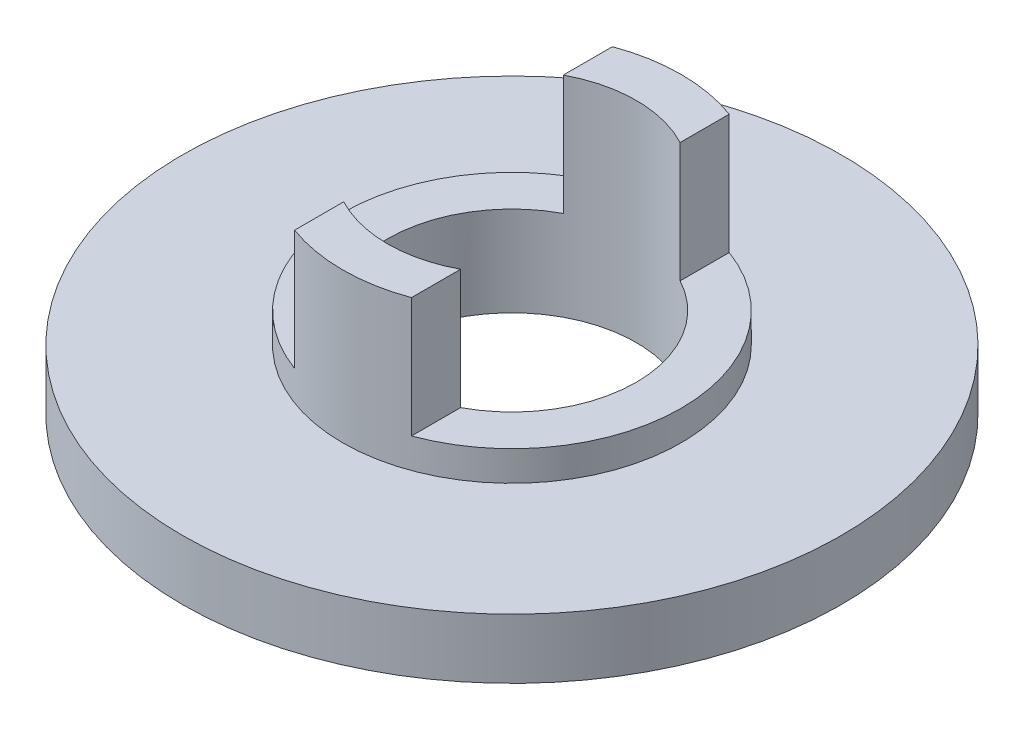
ISO-10303-21;
HEADER;
FILE_DESCRIPTION(('STEP AP214'),'2;1');
FILE_NAME('part.step','',(''),(''),'','','');
FILE_SCHEMA(('AUTOMOTIVE_DESIGN { 1 0 10303 214 1 1 1 1 }'));
ENDSEC;
DATA;
#1=APPLICATION_CONTEXT('core data for automotive mechanical design processes');
#2=APPLICATION_PROTOCOL_DEFINITION('international standard','automotive_design',2000,#1);
#3=PRODUCT_CONTEXT('',#1,'mechanical');
#4=PRODUCT('Part','Part','',(#3));
#5=PRODUCT_RELATED_PRODUCT_CATEGORY('part','',(#4));
#6=PRODUCT_DEFINITION_FORMATION('','',#4);
#7=PRODUCT_DEFINITION_CONTEXT('part definition',#1,'design');
#8=PRODUCT_DEFINITION('design','',#6,#7);
#9=PRODUCT_DEFINITION_SHAPE('','',#8);
#10=(LENGTH_UNIT() NAMED_UNIT(*) SI_UNIT(.MILLI.,.METRE.));
#11=(NAMED_UNIT(*) PLANE_ANGLE_UNIT() SI_UNIT($,.RADIAN.));
#12=(NAMED_UNIT(*) SI_UNIT($,.STERADIAN.) SOLID_ANGLE_UNIT());
#13=UNCERTAINTY_MEASURE_WITH_UNIT(LENGTH_MEASURE(1.E-05),#10,'distance_accuracy_value','');
#14=(GEOMETRIC_REPRESENTATION_CONTEXT(3) GLOBAL_UNCERTAINTY_ASSIGNED_CONTEXT((#13)) GLOBAL_UNIT_ASSIGNED_CONTEXT((#10,
#11,#12)) REPRESENTATION_CONTEXT('',''));
#15=CARTESIAN_POINT('',(0.,0.,0.));
#16=DIRECTION('',(0.,0.,1.));
#17=DIRECTION('',(1.,0.,0.));
#18=AXIS2_PLACEMENT_3D('',#15,#16,#17);
#19=CARTESIAN_POINT('',(0.,5.,0.));
#20=DIRECTION('',(0.,1.,0.));
#21=DIRECTION('',(0.,0.,1.));
#22=AXIS2_PLACEMENT_3D('',#19,#20,#21);
#23=PLANE('',#22);
#24=DIRECTION('',(0.,0.,1.));
#25=VECTOR('',#24,1.);
#26=CARTESIAN_POINT('',(1.95,5.,3.66333181680284));
#27=LINE('',#26,#25);
#28=CARTESIAN_POINT('',(1.95,5.,3.66333181680284));
#29=VERTEX_POINT('',#28);
#30=CARTESIAN_POINT('',(1.95,5.,5.30282943342514));
#31=VERTEX_POINT('',#30);
#32=EDGE_CURVE('E132',#29,#31,#27,.T.);
#33=ORIENTED_EDGE('',*,*,#32,.F.);
#34=CARTESIAN_POINT('',(0.,5.,0.));
#35=DIRECTION('',(0.,1.,0.));
#36=DIRECTION('',(0.,0.,1.));
#37=AXIS2_PLACEMENT_3D('',#34,#35,#36);
#38=CIRCLE('',#37,4.15);
#39=CARTESIAN_POINT('',(-1.95,5.,3.66333181680284));
#40=VERTEX_POINT('',#39);
#41=EDGE_CURVE('E183',#40,#29,#38,.T.);
#42=ORIENTED_EDGE('',*,*,#41,.F.);
#43=DIRECTION('',(0.,0.,-1.));
#44=VECTOR('',#43,1.);
#45=CARTESIAN_POINT('',(-1.95,5.,3.66333181680284));
#46=LINE('',#45,#44);
#47=CARTESIAN_POINT('',(-1.95,5.,5.30282943342514));
#48=VERTEX_POINT('',#47);
#49=EDGE_CURVE('E165',#48,#40,#46,.T.);
#50=ORIENTED_EDGE('',*,*,#49,.F.);
#51=CARTESIAN_POINT('',(0.,5.,0.));
#52=DIRECTION('',(0.,1.,0.));
#53=DIRECTION('',(0.,0.,1.));
#54=AXIS2_PLACEMENT_3D('',#51,#52,#53);
#55=CIRCLE('',#54,5.65);
#56=EDGE_CURVE('E189',#48,#31,#55,.T.);
#57=ORIENTED_EDGE('',*,*,#56,.T.);
#58=EDGE_LOOP('',(#33,#42,#50,#57));
#59=FACE_BOUND('',#58,.T.);
#60=ADVANCED_FACE('F49',(#59),#23,.T.);
#61=CARTESIAN_POINT('',(0.,-2.,0.));
#62=DIRECTION('',(0.,1.,0.));
#63=DIRECTION('',(0.,0.,1.));
#64=AXIS2_PLACEMENT_3D('',#61,#62,#63);
#65=CYLINDRICAL_SURFACE('',#64,11.);
#66=CARTESIAN_POINT('',(0.,-2.,0.));
#67=DIRECTION('',(0.,1.,0.));
#68=DIRECTION('',(0.,0.,1.));
#69=AXIS2_PLACEMENT_3D('',#66,#67,#68);
#70=CIRCLE('',#69,11.);
#71=CARTESIAN_POINT('',(0.,-2.,11.));
#72=VERTEX_POINT('',#71);
#73=EDGE_CURVE('E12',#72,#72,#70,.T.);
#74=ORIENTED_EDGE('',*,*,#73,.T.);
#75=EDGE_LOOP('',(#74));
#76=FACE_BOUND('',#75,.T.);
#77=CARTESIAN_POINT('',(0.,0.,0.));
#78=DIRECTION('',(0.,1.,0.));
#79=DIRECTION('',(0.,0.,1.));
#80=AXIS2_PLACEMENT_3D('',#77,#78,#79);
#81=CIRCLE('',#80,11.);
#82=CARTESIAN_POINT('',(0.,0.,11.));
#83=VERTEX_POINT('',#82);
#84=EDGE_CURVE('E53',#83,#83,#81,.T.);
#85=ORIENTED_EDGE('',*,*,#84,.F.);
#86=EDGE_LOOP('',(#85));
#87=FACE_BOUND('',#86,.T.);
#88=ADVANCED_FACE('F51',(#76,#87),#65,.T.);
#89=CARTESIAN_POINT('',(0.,-2.,0.));
#90=DIRECTION('',(0.,1.,0.));
#91=DIRECTION('',(0.,0.,1.));
#92=AXIS2_PLACEMENT_3D('',#89,#90,#91);
#93=PLANE('',#92);
#94=CARTESIAN_POINT('',(0.,-2.,0.));
#95=DIRECTION('',(0.,1.,0.));
#96=DIRECTION('',(0.,0.,1.));
#97=AXIS2_PLACEMENT_3D('',#94,#95,#96);
#98=CIRCLE('',#97,4.15);
#99=CARTESIAN_POINT('',(0.,-2.,4.15));
#100=VERTEX_POINT('',#99);
#101=EDGE_CURVE('E197',#100,#100,#98,.T.);
#102=ORIENTED_EDGE('',*,*,#101,.T.);
#103=EDGE_LOOP('',(#102));
#104=FACE_BOUND('',#103,.T.);
#105=ORIENTED_EDGE('',*,*,#73,.F.);
#106=EDGE_LOOP('',(#105));
#107=FACE_BOUND('',#106,.T.);
#108=ADVANCED_FACE('F252',(#104,#107),#93,.F.);
#109=CARTESIAN_POINT('',(0.,0.,0.));
#110=DIRECTION('',(0.,1.,0.));
#111=DIRECTION('',(0.,0.,1.));
#112=AXIS2_PLACEMENT_3D('',#109,#110,#111);
#113=PLANE('',#112);
#114=CARTESIAN_POINT('',(0.,0.,0.));
#115=DIRECTION('',(0.,1.,0.));
#116=DIRECTION('',(0.,0.,1.));
#117=AXIS2_PLACEMENT_3D('',#114,#115,#116);
#118=CIRCLE('',#117,5.65);
#119=CARTESIAN_POINT('',(0.,0.,5.65));
#120=VERTEX_POINT('',#119);
#121=EDGE_CURVE('E188',#120,#120,#118,.T.);
#122=ORIENTED_EDGE('',*,*,#121,.F.);
#123=EDGE_LOOP('',(#122));
#124=FACE_BOUND('',#123,.T.);
#125=ORIENTED_EDGE('',*,*,#84,.T.);
#126=EDGE_LOOP('',(#125));
#127=FACE_BOUND('',#126,.T.);
#128=ADVANCED_FACE('F259',(#124,#127),#113,.T.);
#129=CARTESIAN_POINT('',(0.,-2.,0.));
#130=DIRECTION('',(0.,1.,0.));
#131=DIRECTION('',(0.,0.,1.));
#132=AXIS2_PLACEMENT_3D('',#129,#130,#131);
#133=CYLINDRICAL_SURFACE('',#132,4.15);
#134=ORIENTED_EDGE('',*,*,#41,.T.);
#135=DIRECTION('',(0.,1.,0.));
#136=VECTOR('',#135,1.);
#137=CARTESIAN_POINT('',(1.95,1.,3.66333181680284));
#138=LINE('',#137,#136);
#139=CARTESIAN_POINT('',(1.95,1.,3.66333181680284));
#140=VERTEX_POINT('',#139);
#141=EDGE_CURVE('E144',#140,#29,#138,.T.);
#142=ORIENTED_EDGE('',*,*,#141,.F.);
#143=CARTESIAN_POINT('',(0.,1.,0.));
#144=DIRECTION('',(0.,-1.,0.));
#145=DIRECTION('',(0.,0.,1.));
#146=AXIS2_PLACEMENT_3D('',#143,#144,#145);
#147=CIRCLE('',#146,4.15);
#148=CARTESIAN_POINT('',(1.95,1.,-3.66333181680284));
#149=VERTEX_POINT('',#148);
#150=EDGE_CURVE('E121',#149,#140,#147,.T.);
#151=ORIENTED_EDGE('',*,*,#150,.F.);
#152=DIRECTION('',(0.,1.,0.));
#153=VECTOR('',#152,1.);
#154=CARTESIAN_POINT('',(1.95,1.,-3.66333181680284));
#155=LINE('',#154,#153);
#156=CARTESIAN_POINT('',(1.95,5.,-3.66333181680284));
#157=VERTEX_POINT('',#156);
#158=EDGE_CURVE('E117',#149,#157,#155,.T.);
#159=ORIENTED_EDGE('',*,*,#158,.T.);
#160=CARTESIAN_POINT('',(-1.95,5.,-3.66333181680284));
#161=VERTEX_POINT('',#160);
#162=EDGE_CURVE('E187',#157,#161,#38,.T.);
#163=ORIENTED_EDGE('',*,*,#162,.T.);
#164=DIRECTION('',(0.,1.,0.));
#165=VECTOR('',#164,1.);
#166=CARTESIAN_POINT('',(-1.95,1.,-3.66333181680284));
#167=LINE('',#166,#165);
#168=CARTESIAN_POINT('',(-1.95,1.,-3.66333181680284));
#169=VERTEX_POINT('',#168);
#170=EDGE_CURVE('E174',#169,#161,#167,.T.);
#171=ORIENTED_EDGE('',*,*,#170,.F.);
#172=CARTESIAN_POINT('',(0.,1.,0.));
#173=DIRECTION('',(0.,-1.,0.));
#174=DIRECTION('',(0.,0.,1.));
#175=AXIS2_PLACEMENT_3D('',#172,#173,#174);
#176=CIRCLE('',#175,4.15);
#177=CARTESIAN_POINT('',(-1.95,1.,3.66333181680284));
#178=VERTEX_POINT('',#177);
#179=EDGE_CURVE('E158',#178,#169,#176,.T.);
#180=ORIENTED_EDGE('',*,*,#179,.F.);
#181=DIRECTION('',(0.,1.,0.));
#182=VECTOR('',#181,1.);
#183=CARTESIAN_POINT('',(-1.95,1.,3.66333181680284));
#184=LINE('',#183,#182);
#185=EDGE_CURVE('E177',#178,#40,#184,.T.);
#186=ORIENTED_EDGE('',*,*,#185,.T.);
#187=EDGE_LOOP('',(#134,#142,#151,#159,#163,#171,#180,#186));
#188=FACE_BOUND('',#187,.T.);
#189=ORIENTED_EDGE('',*,*,#101,.F.);
#190=EDGE_LOOP('',(#189));
#191=FACE_BOUND('',#190,.T.);
#192=ADVANCED_FACE('F226',(#188,#191),#133,.F.);
#193=CARTESIAN_POINT('',(0.,5.,0.));
#194=DIRECTION('',(0.,-1.,0.));
#195=DIRECTION('',(0.,0.,-1.));
#196=AXIS2_PLACEMENT_3D('',#193,#194,#195);
#197=CYLINDRICAL_SURFACE('',#196,5.65);
#198=CARTESIAN_POINT('',(0.,1.,0.));
#199=DIRECTION('',(0.,1.,0.));
#200=DIRECTION('',(0.,0.,1.));
#201=AXIS2_PLACEMENT_3D('',#198,#199,#200);
#202=CIRCLE('',#201,5.65);
#203=CARTESIAN_POINT('',(1.95,1.,5.30282943342514));
#204=VERTEX_POINT('',#203);
#205=CARTESIAN_POINT('',(1.95,1.,-5.30282943342514));
#206=VERTEX_POINT('',#205);
#207=EDGE_CURVE('E122',#204,#206,#202,.T.);
#208=ORIENTED_EDGE('',*,*,#207,.F.);
#209=DIRECTION('',(0.,1.,0.));
#210=VECTOR('',#209,1.);
#211=CARTESIAN_POINT('',(1.95,1.,5.30282943342514));
#212=LINE('',#211,#210);
#213=EDGE_CURVE('E196',#204,#31,#212,.T.);
#214=ORIENTED_EDGE('',*,*,#213,.T.);
#215=ORIENTED_EDGE('',*,*,#56,.F.);
#216=DIRECTION('',(0.,1.,0.));
#217=VECTOR('',#216,1.);
#218=CARTESIAN_POINT('',(-1.95,1.,5.30282943342514));
#219=LINE('',#218,#217);
#220=CARTESIAN_POINT('',(-1.95,1.,5.30282943342514));
#221=VERTEX_POINT('',#220);
#222=EDGE_CURVE('E65',#221,#48,#219,.T.);
#223=ORIENTED_EDGE('',*,*,#222,.F.);
#224=CARTESIAN_POINT('',(0.,1.,0.));
#225=DIRECTION('',(0.,1.,0.));
#226=DIRECTION('',(0.,0.,1.));
#227=AXIS2_PLACEMENT_3D('',#224,#225,#226);
#228=CIRCLE('',#227,5.65);
#229=CARTESIAN_POINT('',(-1.95,1.,-5.30282943342514));
#230=VERTEX_POINT('',#229);
#231=EDGE_CURVE('E149',#230,#221,#228,.T.);
#232=ORIENTED_EDGE('',*,*,#231,.F.);
#233=DIRECTION('',(0.,1.,0.));
#234=VECTOR('',#233,1.);
#235=CARTESIAN_POINT('',(-1.95,1.,-5.30282943342514));
#236=LINE('',#235,#234);
#237=CARTESIAN_POINT('',(-1.95,5.,-5.30282943342514));
#238=VERTEX_POINT('',#237);
#239=EDGE_CURVE('E170',#230,#238,#236,.T.);
#240=ORIENTED_EDGE('',*,*,#239,.T.);
#241=CARTESIAN_POINT('',(1.95,5.,-5.30282943342514));
#242=VERTEX_POINT('',#241);
#243=EDGE_CURVE('E139',#242,#238,#55,.T.);
#244=ORIENTED_EDGE('',*,*,#243,.F.);
#245=DIRECTION('',(0.,1.,0.));
#246=VECTOR('',#245,1.);
#247=CARTESIAN_POINT('',(1.95,1.,-5.30282943342514));
#248=LINE('',#247,#246);
#249=EDGE_CURVE('E73',#206,#242,#248,.T.);
#250=ORIENTED_EDGE('',*,*,#249,.F.);
#251=EDGE_LOOP('',(#208,#214,#215,#223,#232,#240,#244,#250));
#252=FACE_BOUND('',#251,.T.);
#253=ORIENTED_EDGE('',*,*,#121,.T.);
#254=EDGE_LOOP('',(#253));
#255=FACE_BOUND('',#254,.T.);
#256=ADVANCED_FACE('F135',(#252,#255),#197,.T.);
#257=DIRECTION('',(0.,0.,1.));
#258=VECTOR('',#257,1.);
#259=CARTESIAN_POINT('',(1.95,5.,-5.30282943342514));
#260=LINE('',#259,#258);
#261=EDGE_CURVE('E173',#242,#157,#260,.T.);
#262=ORIENTED_EDGE('',*,*,#261,.F.);
#263=ORIENTED_EDGE('',*,*,#243,.T.);
#264=DIRECTION('',(0.,0.,-1.));
#265=VECTOR('',#264,1.);
#266=CARTESIAN_POINT('',(-1.95,5.,-5.30282943342514));
#267=LINE('',#266,#265);
#268=EDGE_CURVE('E154',#161,#238,#267,.T.);
#269=ORIENTED_EDGE('',*,*,#268,.F.);
#270=ORIENTED_EDGE('',*,*,#162,.F.);
#271=EDGE_LOOP('',(#262,#263,#269,#270));
#272=FACE_BOUND('',#271,.T.);
#273=ADVANCED_FACE('F207',(#272),#23,.T.);
#274=CARTESIAN_POINT('',(-1.95,1.,-5.30282943342514));
#275=DIRECTION('',(1.,0.,0.));
#276=DIRECTION('',(0.,0.,-1.));
#277=AXIS2_PLACEMENT_3D('',#274,#275,#276);
#278=PLANE('',#277);
#279=ORIENTED_EDGE('',*,*,#268,.T.);
#280=ORIENTED_EDGE('',*,*,#239,.F.);
#281=DIRECTION('',(0.,0.,-1.));
#282=VECTOR('',#281,1.);
#283=CARTESIAN_POINT('',(-1.95,1.,-5.30282943342514));
#284=LINE('',#283,#282);
#285=EDGE_CURVE('E161',#169,#230,#284,.T.);
#286=ORIENTED_EDGE('',*,*,#285,.F.);
#287=ORIENTED_EDGE('',*,*,#170,.T.);
#288=EDGE_LOOP('',(#279,#280,#286,#287));
#289=FACE_BOUND('',#288,.T.);
#290=ADVANCED_FACE('F236',(#289),#278,.F.);
#291=CARTESIAN_POINT('',(-1.95,1.,3.66333181680284));
#292=DIRECTION('',(1.,0.,0.));
#293=DIRECTION('',(0.,0.,-1.));
#294=AXIS2_PLACEMENT_3D('',#291,#292,#293);
#295=PLANE('',#294);
#296=ORIENTED_EDGE('',*,*,#49,.T.);
#297=ORIENTED_EDGE('',*,*,#185,.F.);
#298=DIRECTION('',(0.,0.,-1.));
#299=VECTOR('',#298,1.);
#300=CARTESIAN_POINT('',(-1.95,1.,3.66333181680284));
#301=LINE('',#300,#299);
#302=EDGE_CURVE('E153',#221,#178,#301,.T.);
#303=ORIENTED_EDGE('',*,*,#302,.F.);
#304=ORIENTED_EDGE('',*,*,#222,.T.);
#305=EDGE_LOOP('',(#296,#297,#303,#304));
#306=FACE_BOUND('',#305,.T.);
#307=ADVANCED_FACE('F230',(#306),#295,.F.);
#308=CARTESIAN_POINT('',(0.,1.,0.));
#309=DIRECTION('',(0.,1.,0.));
#310=DIRECTION('',(0.,0.,1.));
#311=AXIS2_PLACEMENT_3D('',#308,#309,#310);
#312=PLANE('',#311);
#313=ORIENTED_EDGE('',*,*,#231,.T.);
#314=ORIENTED_EDGE('',*,*,#302,.T.);
#315=ORIENTED_EDGE('',*,*,#179,.T.);
#316=ORIENTED_EDGE('',*,*,#285,.T.);
#317=EDGE_LOOP('',(#313,#314,#315,#316));
#318=FACE_BOUND('',#317,.T.);
#319=ADVANCED_FACE('F232',(#318),#312,.T.);
#320=CARTESIAN_POINT('',(1.95,1.,3.66333181680284));
#321=DIRECTION('',(-1.,0.,0.));
#322=DIRECTION('',(0.,0.,1.));
#323=AXIS2_PLACEMENT_3D('',#320,#321,#322);
#324=PLANE('',#323);
#325=ORIENTED_EDGE('',*,*,#32,.T.);
#326=ORIENTED_EDGE('',*,*,#213,.F.);
#327=DIRECTION('',(0.,0.,1.));
#328=VECTOR('',#327,1.);
#329=CARTESIAN_POINT('',(1.95,1.,3.66333181680284));
#330=LINE('',#329,#328);
#331=EDGE_CURVE('E128',#140,#204,#330,.T.);
#332=ORIENTED_EDGE('',*,*,#331,.F.);
#333=ORIENTED_EDGE('',*,*,#141,.T.);
#334=EDGE_LOOP('',(#325,#326,#332,#333));
#335=FACE_BOUND('',#334,.T.);
#336=ADVANCED_FACE('F221',(#335),#324,.F.);
#337=CARTESIAN_POINT('',(1.95,1.,-5.30282943342514));
#338=DIRECTION('',(-1.,0.,0.));
#339=DIRECTION('',(0.,0.,1.));
#340=AXIS2_PLACEMENT_3D('',#337,#338,#339);
#341=PLANE('',#340);
#342=ORIENTED_EDGE('',*,*,#261,.T.);
#343=ORIENTED_EDGE('',*,*,#158,.F.);
#344=DIRECTION('',(0.,0.,1.));
#345=VECTOR('',#344,1.);
#346=CARTESIAN_POINT('',(1.95,1.,-5.30282943342514));
#347=LINE('',#346,#345);
#348=EDGE_CURVE('E113',#206,#149,#347,.T.);
#349=ORIENTED_EDGE('',*,*,#348,.F.);
#350=ORIENTED_EDGE('',*,*,#249,.T.);
#351=EDGE_LOOP('',(#342,#343,#349,#350));
#352=FACE_BOUND('',#351,.T.);
#353=ADVANCED_FACE('F115',(#352),#341,.F.);
#354=CARTESIAN_POINT('',(0.,1.,0.));
#355=DIRECTION('',(0.,1.,0.));
#356=DIRECTION('',(0.,0.,1.));
#357=AXIS2_PLACEMENT_3D('',#354,#355,#356);
#358=PLANE('',#357);
#359=ORIENTED_EDGE('',*,*,#207,.T.);
#360=ORIENTED_EDGE('',*,*,#348,.T.);
#361=ORIENTED_EDGE('',*,*,#150,.T.);
#362=ORIENTED_EDGE('',*,*,#331,.T.);
#363=EDGE_LOOP('',(#359,#360,#361,#362));
#364=FACE_BOUND('',#363,.T.);
#365=ADVANCED_FACE('F126',(#364),#358,.T.);
#366=CLOSED_SHELL('',(#60,#88,#108,#128,#192,#256,#273,#290,#307,#319,#336,#353,#365));
#367=MANIFOLD_SOLID_BREP('B2',#366);
#368=ADVANCED_BREP_SHAPE_REPRESENTATION('',(#18,#367),#14);
#369=SHAPE_DEFINITION_REPRESENTATION(#9,#368);
ENDSEC;
END-ISO-10303-21;
